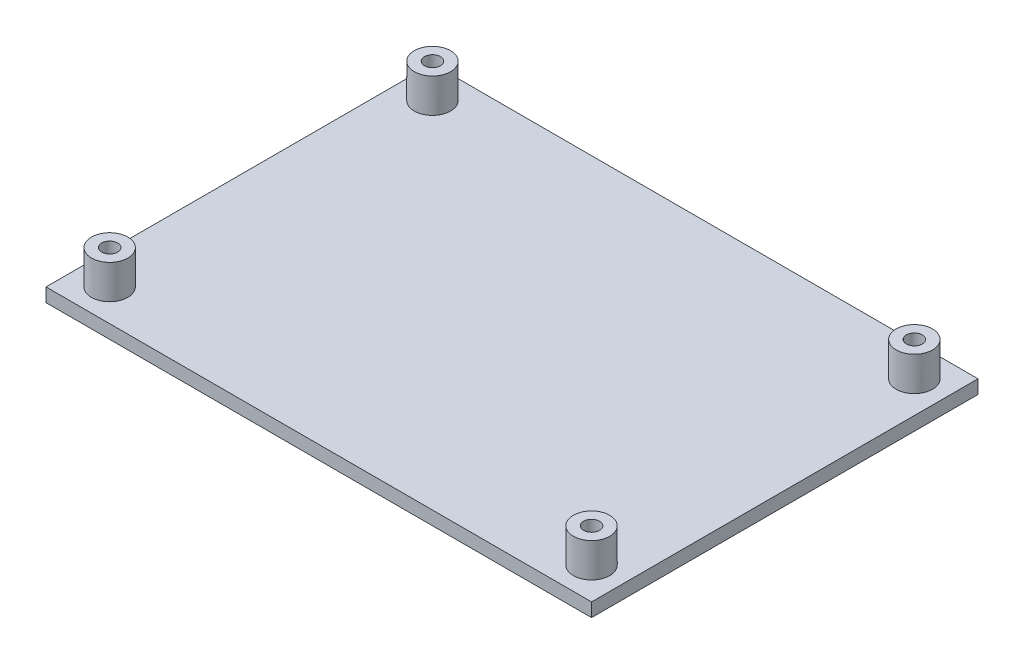
ISO-10303-21;
HEADER;
FILE_DESCRIPTION(('STEP AP214'),'2;1');
FILE_NAME('part.step','',(''),(''),'','','');
FILE_SCHEMA(('AUTOMOTIVE_DESIGN { 1 0 10303 214 1 1 1 1 }'));
ENDSEC;
DATA;
#1=APPLICATION_CONTEXT('core data for automotive mechanical design processes');
#2=APPLICATION_PROTOCOL_DEFINITION('international standard','automotive_design',2000,#1);
#3=PRODUCT_CONTEXT('',#1,'mechanical');
#4=PRODUCT('Part','Part','',(#3));
#5=PRODUCT_RELATED_PRODUCT_CATEGORY('part','',(#4));
#6=PRODUCT_DEFINITION_FORMATION('','',#4);
#7=PRODUCT_DEFINITION_CONTEXT('part definition',#1,'design');
#8=PRODUCT_DEFINITION('design','',#6,#7);
#9=PRODUCT_DEFINITION_SHAPE('','',#8);
#10=(LENGTH_UNIT() NAMED_UNIT(*) SI_UNIT(.MILLI.,.METRE.));
#11=(NAMED_UNIT(*) PLANE_ANGLE_UNIT() SI_UNIT($,.RADIAN.));
#12=(NAMED_UNIT(*) SI_UNIT($,.STERADIAN.) SOLID_ANGLE_UNIT());
#13=UNCERTAINTY_MEASURE_WITH_UNIT(LENGTH_MEASURE(1.E-05),#10,'distance_accuracy_value','');
#14=(GEOMETRIC_REPRESENTATION_CONTEXT(3) GLOBAL_UNCERTAINTY_ASSIGNED_CONTEXT((#13)) GLOBAL_UNIT_ASSIGNED_CONTEXT((#10,
#11,#12)) REPRESENTATION_CONTEXT('',''));
#15=CARTESIAN_POINT('',(0.,0.,0.));
#16=DIRECTION('',(0.,0.,1.));
#17=DIRECTION('',(1.,0.,0.));
#18=AXIS2_PLACEMENT_3D('',#15,#16,#17);
#19=CARTESIAN_POINT('',(0.,3.,0.));
#20=DIRECTION('',(1.,0.,0.));
#21=DIRECTION('',(0.,0.,-1.));
#22=AXIS2_PLACEMENT_3D('',#19,#20,#21);
#23=PLANE('',#22);
#24=DIRECTION('',(0.,0.,1.));
#25=VECTOR('',#24,1.);
#26=CARTESIAN_POINT('',(0.,0.,0.));
#27=LINE('',#26,#25);
#28=CARTESIAN_POINT('',(0.,0.,-85.));
#29=VERTEX_POINT('',#28);
#30=CARTESIAN_POINT('',(0.,0.,0.));
#31=VERTEX_POINT('',#30);
#32=EDGE_CURVE('E102',#29,#31,#27,.T.);
#33=ORIENTED_EDGE('',*,*,#32,.T.);
#34=DIRECTION('',(0.,-1.,0.));
#35=VECTOR('',#34,1.);
#36=CARTESIAN_POINT('',(0.,3.,0.));
#37=LINE('',#36,#35);
#38=CARTESIAN_POINT('',(0.,3.,0.));
#39=VERTEX_POINT('',#38);
#40=EDGE_CURVE('E93',#39,#31,#37,.T.);
#41=ORIENTED_EDGE('',*,*,#40,.F.);
#42=DIRECTION('',(0.,0.,1.));
#43=VECTOR('',#42,1.);
#44=CARTESIAN_POINT('',(0.,3.,0.));
#45=LINE('',#44,#43);
#46=CARTESIAN_POINT('',(0.,3.,-85.));
#47=VERTEX_POINT('',#46);
#48=EDGE_CURVE('E87',#47,#39,#45,.T.);
#49=ORIENTED_EDGE('',*,*,#48,.F.);
#50=DIRECTION('',(0.,-1.,0.));
#51=VECTOR('',#50,1.);
#52=CARTESIAN_POINT('',(0.,3.,-85.));
#53=LINE('',#52,#51);
#54=EDGE_CURVE('E98',#47,#29,#53,.T.);
#55=ORIENTED_EDGE('',*,*,#54,.T.);
#56=EDGE_LOOP('',(#33,#41,#49,#55));
#57=FACE_BOUND('',#56,.T.);
#58=ADVANCED_FACE('F35',(#57),#23,.F.);
#59=CARTESIAN_POINT('',(0.,3.,0.));
#60=DIRECTION('',(0.,0.,-1.));
#61=DIRECTION('',(-1.,0.,0.));
#62=AXIS2_PLACEMENT_3D('',#59,#60,#61);
#63=PLANE('',#62);
#64=DIRECTION('',(1.,0.,0.));
#65=VECTOR('',#64,1.);
#66=CARTESIAN_POINT('',(0.,0.,0.));
#67=LINE('',#66,#65);
#68=CARTESIAN_POINT('',(120.,0.,0.));
#69=VERTEX_POINT('',#68);
#70=EDGE_CURVE('E92',#31,#69,#67,.T.);
#71=ORIENTED_EDGE('',*,*,#70,.T.);
#72=DIRECTION('',(0.,-1.,0.));
#73=VECTOR('',#72,1.);
#74=CARTESIAN_POINT('',(120.,3.,0.));
#75=LINE('',#74,#73);
#76=CARTESIAN_POINT('',(120.,3.,0.));
#77=VERTEX_POINT('',#76);
#78=EDGE_CURVE('E90',#77,#69,#75,.T.);
#79=ORIENTED_EDGE('',*,*,#78,.F.);
#80=DIRECTION('',(1.,0.,0.));
#81=VECTOR('',#80,1.);
#82=CARTESIAN_POINT('',(0.,3.,0.));
#83=LINE('',#82,#81);
#84=EDGE_CURVE('E82',#39,#77,#83,.T.);
#85=ORIENTED_EDGE('',*,*,#84,.F.);
#86=ORIENTED_EDGE('',*,*,#40,.T.);
#87=EDGE_LOOP('',(#71,#79,#85,#86));
#88=FACE_BOUND('',#87,.T.);
#89=ADVANCED_FACE('F91',(#88),#63,.F.);
#90=CARTESIAN_POINT('',(120.,3.,0.));
#91=DIRECTION('',(-1.,0.,0.));
#92=DIRECTION('',(0.,0.,1.));
#93=AXIS2_PLACEMENT_3D('',#90,#91,#92);
#94=PLANE('',#93);
#95=DIRECTION('',(0.,0.,-1.));
#96=VECTOR('',#95,1.);
#97=CARTESIAN_POINT('',(120.,0.,0.));
#98=LINE('',#97,#96);
#99=CARTESIAN_POINT('',(120.,0.,-85.));
#100=VERTEX_POINT('',#99);
#101=EDGE_CURVE('E68',#69,#100,#98,.T.);
#102=ORIENTED_EDGE('',*,*,#101,.T.);
#103=DIRECTION('',(0.,-1.,0.));
#104=VECTOR('',#103,1.);
#105=CARTESIAN_POINT('',(120.,3.,-85.));
#106=LINE('',#105,#104);
#107=CARTESIAN_POINT('',(120.,3.,-85.));
#108=VERTEX_POINT('',#107);
#109=EDGE_CURVE('E94',#108,#100,#106,.T.);
#110=ORIENTED_EDGE('',*,*,#109,.F.);
#111=DIRECTION('',(0.,0.,-1.));
#112=VECTOR('',#111,1.);
#113=CARTESIAN_POINT('',(120.,3.,0.));
#114=LINE('',#113,#112);
#115=EDGE_CURVE('E85',#77,#108,#114,.T.);
#116=ORIENTED_EDGE('',*,*,#115,.F.);
#117=ORIENTED_EDGE('',*,*,#78,.T.);
#118=EDGE_LOOP('',(#102,#110,#116,#117));
#119=FACE_BOUND('',#118,.T.);
#120=ADVANCED_FACE('F96',(#119),#94,.F.);
#121=CARTESIAN_POINT('',(0.,3.,-85.));
#122=DIRECTION('',(0.,0.,1.));
#123=DIRECTION('',(1.,0.,0.));
#124=AXIS2_PLACEMENT_3D('',#121,#122,#123);
#125=PLANE('',#124);
#126=DIRECTION('',(-1.,0.,0.));
#127=VECTOR('',#126,1.);
#128=CARTESIAN_POINT('',(0.,0.,-85.));
#129=LINE('',#128,#127);
#130=EDGE_CURVE('E74',#100,#29,#129,.T.);
#131=ORIENTED_EDGE('',*,*,#130,.T.);
#132=ORIENTED_EDGE('',*,*,#54,.F.);
#133=DIRECTION('',(-1.,0.,0.));
#134=VECTOR('',#133,1.);
#135=CARTESIAN_POINT('',(0.,3.,-85.));
#136=LINE('',#135,#134);
#137=EDGE_CURVE('E51',#108,#47,#136,.T.);
#138=ORIENTED_EDGE('',*,*,#137,.F.);
#139=ORIENTED_EDGE('',*,*,#109,.T.);
#140=EDGE_LOOP('',(#131,#132,#138,#139));
#141=FACE_BOUND('',#140,.T.);
#142=ADVANCED_FACE('F125',(#141),#125,.F.);
#143=CARTESIAN_POINT('',(0.,3.,0.));
#144=DIRECTION('',(0.,-1.,0.));
#145=DIRECTION('',(0.,0.,-1.));
#146=AXIS2_PLACEMENT_3D('',#143,#144,#145);
#147=PLANE('',#146);
#148=CARTESIAN_POINT('',(113.,3.,-78.));
#149=DIRECTION('',(0.,-1.,0.));
#150=DIRECTION('',(0.,0.,-1.));
#151=AXIS2_PLACEMENT_3D('',#148,#149,#150);
#152=CIRCLE('',#151,4.00000000000001);
#153=CARTESIAN_POINT('',(113.,3.,-82.));
#154=VERTEX_POINT('',#153);
#155=EDGE_CURVE('E11',#154,#154,#152,.F.);
#156=ORIENTED_EDGE('',*,*,#155,.F.);
#157=EDGE_LOOP('',(#156));
#158=FACE_BOUND('',#157,.T.);
#159=CARTESIAN_POINT('',(113.,3.,-7.));
#160=DIRECTION('',(0.,-1.,0.));
#161=DIRECTION('',(0.,0.,-1.));
#162=AXIS2_PLACEMENT_3D('',#159,#160,#161);
#163=CIRCLE('',#162,4.00000000000001);
#164=CARTESIAN_POINT('',(113.,3.,-11.));
#165=VERTEX_POINT('',#164);
#166=EDGE_CURVE('E43',#165,#165,#163,.F.);
#167=ORIENTED_EDGE('',*,*,#166,.F.);
#168=EDGE_LOOP('',(#167));
#169=FACE_BOUND('',#168,.T.);
#170=CARTESIAN_POINT('',(7.00000000000001,3.,-7.));
#171=DIRECTION('',(0.,-1.,0.));
#172=DIRECTION('',(0.,0.,-1.));
#173=AXIS2_PLACEMENT_3D('',#170,#171,#172);
#174=CIRCLE('',#173,4.);
#175=CARTESIAN_POINT('',(7.00000000000001,3.,-11.));
#176=VERTEX_POINT('',#175);
#177=EDGE_CURVE('E115',#176,#176,#174,.F.);
#178=ORIENTED_EDGE('',*,*,#177,.F.);
#179=EDGE_LOOP('',(#178));
#180=FACE_BOUND('',#179,.T.);
#181=CARTESIAN_POINT('',(7.00000000000001,3.,-78.));
#182=DIRECTION('',(0.,-1.,0.));
#183=DIRECTION('',(0.,0.,-1.));
#184=AXIS2_PLACEMENT_3D('',#181,#182,#183);
#185=CIRCLE('',#184,4.);
#186=CARTESIAN_POINT('',(7.00000000000001,3.,-82.));
#187=VERTEX_POINT('',#186);
#188=EDGE_CURVE('E112',#187,#187,#185,.F.);
#189=ORIENTED_EDGE('',*,*,#188,.F.);
#190=EDGE_LOOP('',(#189));
#191=FACE_BOUND('',#190,.T.);
#192=ORIENTED_EDGE('',*,*,#48,.T.);
#193=ORIENTED_EDGE('',*,*,#84,.T.);
#194=ORIENTED_EDGE('',*,*,#115,.T.);
#195=ORIENTED_EDGE('',*,*,#137,.T.);
#196=EDGE_LOOP('',(#192,#193,#194,#195));
#197=FACE_BOUND('',#196,.T.);
#198=ADVANCED_FACE('F83',(#158,#169,#180,#191,#197),#147,.F.);
#199=CARTESIAN_POINT('',(0.,0.,0.));
#200=DIRECTION('',(0.,-1.,0.));
#201=DIRECTION('',(0.,0.,-1.));
#202=AXIS2_PLACEMENT_3D('',#199,#200,#201);
#203=PLANE('',#202);
#204=ORIENTED_EDGE('',*,*,#32,.F.);
#205=ORIENTED_EDGE('',*,*,#130,.F.);
#206=ORIENTED_EDGE('',*,*,#101,.F.);
#207=ORIENTED_EDGE('',*,*,#70,.F.);
#208=EDGE_LOOP('',(#204,#205,#206,#207));
#209=FACE_BOUND('',#208,.T.);
#210=ADVANCED_FACE('F124',(#209),#203,.T.);
#211=CARTESIAN_POINT('',(7.00000000000001,10.5,-78.));
#212=DIRECTION('',(0.,1.,0.));
#213=DIRECTION('',(0.,0.,1.));
#214=AXIS2_PLACEMENT_3D('',#211,#212,#213);
#215=PLANE('',#214);
#216=CARTESIAN_POINT('',(7.00000000000001,10.5,-78.));
#217=DIRECTION('',(0.,1.,0.));
#218=DIRECTION('',(0.,0.,1.));
#219=AXIS2_PLACEMENT_3D('',#216,#217,#218);
#220=CIRCLE('',#219,4.);
#221=CARTESIAN_POINT('',(7.00000000000001,10.5,-74.));
#222=VERTEX_POINT('',#221);
#223=EDGE_CURVE('E105',#222,#222,#220,.T.);
#224=ORIENTED_EDGE('',*,*,#223,.T.);
#225=EDGE_LOOP('',(#224));
#226=FACE_BOUND('',#225,.T.);
#227=CARTESIAN_POINT('',(7.00000000000001,10.5,-78.));
#228=DIRECTION('',(0.,1.,0.));
#229=DIRECTION('',(0.,0.,1.));
#230=AXIS2_PLACEMENT_3D('',#227,#228,#229);
#231=CIRCLE('',#230,1.75);
#232=CARTESIAN_POINT('',(7.00000000000001,10.5,-76.25));
#233=VERTEX_POINT('',#232);
#234=EDGE_CURVE('E352',#233,#233,#231,.T.);
#235=ORIENTED_EDGE('',*,*,#234,.F.);
#236=EDGE_LOOP('',(#235));
#237=FACE_BOUND('',#236,.T.);
#238=ADVANCED_FACE('F137',(#226,#237),#215,.T.);
#239=CARTESIAN_POINT('',(7.00000000000001,10.5,-78.));
#240=DIRECTION('',(0.,-1.,0.));
#241=DIRECTION('',(0.,0.,-1.));
#242=AXIS2_PLACEMENT_3D('',#239,#240,#241);
#243=CYLINDRICAL_SURFACE('',#242,4.);
#244=ORIENTED_EDGE('',*,*,#223,.F.);
#245=EDGE_LOOP('',(#244));
#246=FACE_BOUND('',#245,.T.);
#247=ORIENTED_EDGE('',*,*,#188,.T.);
#248=EDGE_LOOP('',(#247));
#249=FACE_BOUND('',#248,.T.);
#250=ADVANCED_FACE('F134',(#246,#249),#243,.T.);
#251=CARTESIAN_POINT('',(7.00000000000001,10.5,-78.));
#252=DIRECTION('',(0.,-1.,0.));
#253=DIRECTION('',(0.,0.,-1.));
#254=AXIS2_PLACEMENT_3D('',#251,#252,#253);
#255=CYLINDRICAL_SURFACE('',#254,1.75);
#256=ORIENTED_EDGE('',*,*,#234,.T.);
#257=EDGE_LOOP('',(#256));
#258=FACE_BOUND('',#257,.T.);
#259=CARTESIAN_POINT('',(7.00000000000001,3.,-78.));
#260=DIRECTION('',(0.,1.,0.));
#261=DIRECTION('',(0.,0.,1.));
#262=AXIS2_PLACEMENT_3D('',#259,#260,#261);
#263=CIRCLE('',#262,1.75);
#264=CARTESIAN_POINT('',(7.00000000000001,3.,-76.25));
#265=VERTEX_POINT('',#264);
#266=EDGE_CURVE('E351',#265,#265,#263,.T.);
#267=ORIENTED_EDGE('',*,*,#266,.F.);
#268=EDGE_LOOP('',(#267));
#269=FACE_BOUND('',#268,.T.);
#270=ADVANCED_FACE('F136',(#258,#269),#255,.F.);
#271=ORIENTED_EDGE('',*,*,#266,.T.);
#272=EDGE_LOOP('',(#271));
#273=FACE_BOUND('',#272,.T.);
#274=ADVANCED_FACE('F129',(#273),#147,.F.);
#275=CARTESIAN_POINT('',(7.00000000000001,10.5,-7.));
#276=DIRECTION('',(0.,1.,0.));
#277=DIRECTION('',(0.,0.,1.));
#278=AXIS2_PLACEMENT_3D('',#275,#276,#277);
#279=PLANE('',#278);
#280=CARTESIAN_POINT('',(7.00000000000001,10.5,-7.));
#281=DIRECTION('',(0.,1.,0.));
#282=DIRECTION('',(0.,0.,1.));
#283=AXIS2_PLACEMENT_3D('',#280,#281,#282);
#284=CIRCLE('',#283,4.);
#285=CARTESIAN_POINT('',(7.00000000000001,10.5,-3.));
#286=VERTEX_POINT('',#285);
#287=EDGE_CURVE('E346',#286,#286,#284,.T.);
#288=ORIENTED_EDGE('',*,*,#287,.T.);
#289=EDGE_LOOP('',(#288));
#290=FACE_BOUND('',#289,.T.);
#291=CARTESIAN_POINT('',(7.00000000000001,10.5,-7.));
#292=DIRECTION('',(0.,1.,0.));
#293=DIRECTION('',(0.,0.,1.));
#294=AXIS2_PLACEMENT_3D('',#291,#292,#293);
#295=CIRCLE('',#294,1.75);
#296=CARTESIAN_POINT('',(7.00000000000001,10.5,-5.25));
#297=VERTEX_POINT('',#296);
#298=EDGE_CURVE('E343',#297,#297,#295,.T.);
#299=ORIENTED_EDGE('',*,*,#298,.F.);
#300=EDGE_LOOP('',(#299));
#301=FACE_BOUND('',#300,.T.);
#302=ADVANCED_FACE('F205',(#290,#301),#279,.T.);
#303=CARTESIAN_POINT('',(7.00000000000001,10.5,-7.));
#304=DIRECTION('',(0.,-1.,0.));
#305=DIRECTION('',(0.,0.,-1.));
#306=AXIS2_PLACEMENT_3D('',#303,#304,#305);
#307=CYLINDRICAL_SURFACE('',#306,4.);
#308=ORIENTED_EDGE('',*,*,#287,.F.);
#309=EDGE_LOOP('',(#308));
#310=FACE_BOUND('',#309,.T.);
#311=ORIENTED_EDGE('',*,*,#177,.T.);
#312=EDGE_LOOP('',(#311));
#313=FACE_BOUND('',#312,.T.);
#314=ADVANCED_FACE('F215',(#310,#313),#307,.T.);
#315=CARTESIAN_POINT('',(7.00000000000001,10.5,-7.));
#316=DIRECTION('',(0.,-1.,0.));
#317=DIRECTION('',(0.,0.,-1.));
#318=AXIS2_PLACEMENT_3D('',#315,#316,#317);
#319=CYLINDRICAL_SURFACE('',#318,1.75);
#320=ORIENTED_EDGE('',*,*,#298,.T.);
#321=EDGE_LOOP('',(#320));
#322=FACE_BOUND('',#321,.T.);
#323=CARTESIAN_POINT('',(7.00000000000001,3.,-7.));
#324=DIRECTION('',(0.,1.,0.));
#325=DIRECTION('',(0.,0.,1.));
#326=AXIS2_PLACEMENT_3D('',#323,#324,#325);
#327=CIRCLE('',#326,1.75);
#328=CARTESIAN_POINT('',(7.00000000000001,3.,-5.25));
#329=VERTEX_POINT('',#328);
#330=EDGE_CURVE('E342',#329,#329,#327,.T.);
#331=ORIENTED_EDGE('',*,*,#330,.F.);
#332=EDGE_LOOP('',(#331));
#333=FACE_BOUND('',#332,.T.);
#334=ADVANCED_FACE('F225',(#322,#333),#319,.F.);
#335=ORIENTED_EDGE('',*,*,#330,.T.);
#336=EDGE_LOOP('',(#335));
#337=FACE_BOUND('',#336,.T.);
#338=ADVANCED_FACE('F207',(#337),#147,.F.);
#339=CARTESIAN_POINT('',(113.,10.5,-7.));
#340=DIRECTION('',(0.,1.,0.));
#341=DIRECTION('',(0.,0.,1.));
#342=AXIS2_PLACEMENT_3D('',#339,#340,#341);
#343=PLANE('',#342);
#344=CARTESIAN_POINT('',(113.,10.5,-7.));
#345=DIRECTION('',(0.,1.,0.));
#346=DIRECTION('',(0.,0.,1.));
#347=AXIS2_PLACEMENT_3D('',#344,#345,#346);
#348=CIRCLE('',#347,4.00000000000001);
#349=CARTESIAN_POINT('',(113.,10.5,-2.99999999999999));
#350=VERTEX_POINT('',#349);
#351=EDGE_CURVE('E337',#350,#350,#348,.T.);
#352=ORIENTED_EDGE('',*,*,#351,.T.);
#353=EDGE_LOOP('',(#352));
#354=FACE_BOUND('',#353,.T.);
#355=CARTESIAN_POINT('',(113.,10.5,-7.));
#356=DIRECTION('',(0.,1.,0.));
#357=DIRECTION('',(0.,0.,1.));
#358=AXIS2_PLACEMENT_3D('',#355,#356,#357);
#359=CIRCLE('',#358,1.75);
#360=CARTESIAN_POINT('',(113.,10.5,-5.25));
#361=VERTEX_POINT('',#360);
#362=EDGE_CURVE('E334',#361,#361,#359,.T.);
#363=ORIENTED_EDGE('',*,*,#362,.F.);
#364=EDGE_LOOP('',(#363));
#365=FACE_BOUND('',#364,.T.);
#366=ADVANCED_FACE('F244',(#354,#365),#343,.T.);
#367=CARTESIAN_POINT('',(113.,10.5,-7.));
#368=DIRECTION('',(0.,-1.,0.));
#369=DIRECTION('',(0.,0.,-1.));
#370=AXIS2_PLACEMENT_3D('',#367,#368,#369);
#371=CYLINDRICAL_SURFACE('',#370,4.00000000000001);
#372=ORIENTED_EDGE('',*,*,#351,.F.);
#373=EDGE_LOOP('',(#372));
#374=FACE_BOUND('',#373,.T.);
#375=ORIENTED_EDGE('',*,*,#166,.T.);
#376=EDGE_LOOP('',(#375));
#377=FACE_BOUND('',#376,.T.);
#378=ADVANCED_FACE('F120',(#374,#377),#371,.T.);
#379=CARTESIAN_POINT('',(113.,10.5,-7.));
#380=DIRECTION('',(0.,-1.,0.));
#381=DIRECTION('',(0.,0.,-1.));
#382=AXIS2_PLACEMENT_3D('',#379,#380,#381);
#383=CYLINDRICAL_SURFACE('',#382,1.75);
#384=ORIENTED_EDGE('',*,*,#362,.T.);
#385=EDGE_LOOP('',(#384));
#386=FACE_BOUND('',#385,.T.);
#387=CARTESIAN_POINT('',(113.,3.,-7.));
#388=DIRECTION('',(0.,1.,0.));
#389=DIRECTION('',(0.,0.,1.));
#390=AXIS2_PLACEMENT_3D('',#387,#388,#389);
#391=CIRCLE('',#390,1.75);
#392=CARTESIAN_POINT('',(113.,3.,-5.25));
#393=VERTEX_POINT('',#392);
#394=EDGE_CURVE('E333',#393,#393,#391,.T.);
#395=ORIENTED_EDGE('',*,*,#394,.F.);
#396=EDGE_LOOP('',(#395));
#397=FACE_BOUND('',#396,.T.);
#398=ADVANCED_FACE('F263',(#386,#397),#383,.F.);
#399=ORIENTED_EDGE('',*,*,#394,.T.);
#400=EDGE_LOOP('',(#399));
#401=FACE_BOUND('',#400,.T.);
#402=ADVANCED_FACE('F246',(#401),#147,.F.);
#403=CARTESIAN_POINT('',(113.,10.5,-78.));
#404=DIRECTION('',(0.,1.,0.));
#405=DIRECTION('',(0.,0.,1.));
#406=AXIS2_PLACEMENT_3D('',#403,#404,#405);
#407=PLANE('',#406);
#408=CARTESIAN_POINT('',(113.,10.5,-78.));
#409=DIRECTION('',(0.,1.,0.));
#410=DIRECTION('',(0.,0.,1.));
#411=AXIS2_PLACEMENT_3D('',#408,#409,#410);
#412=CIRCLE('',#411,4.00000000000001);
#413=CARTESIAN_POINT('',(113.,10.5,-74.));
#414=VERTEX_POINT('',#413);
#415=EDGE_CURVE('E328',#414,#414,#412,.T.);
#416=ORIENTED_EDGE('',*,*,#415,.T.);
#417=EDGE_LOOP('',(#416));
#418=FACE_BOUND('',#417,.T.);
#419=CARTESIAN_POINT('',(113.,10.5,-78.));
#420=DIRECTION('',(0.,1.,0.));
#421=DIRECTION('',(0.,0.,1.));
#422=AXIS2_PLACEMENT_3D('',#419,#420,#421);
#423=CIRCLE('',#422,1.75);
#424=CARTESIAN_POINT('',(113.,10.5,-76.25));
#425=VERTEX_POINT('',#424);
#426=EDGE_CURVE('E325',#425,#425,#423,.T.);
#427=ORIENTED_EDGE('',*,*,#426,.F.);
#428=EDGE_LOOP('',(#427));
#429=FACE_BOUND('',#428,.T.);
#430=ADVANCED_FACE('F282',(#418,#429),#407,.T.);
#431=CARTESIAN_POINT('',(113.,10.5,-78.));
#432=DIRECTION('',(0.,-1.,0.));
#433=DIRECTION('',(0.,0.,-1.));
#434=AXIS2_PLACEMENT_3D('',#431,#432,#433);
#435=CYLINDRICAL_SURFACE('',#434,4.00000000000001);
#436=ORIENTED_EDGE('',*,*,#415,.F.);
#437=EDGE_LOOP('',(#436));
#438=FACE_BOUND('',#437,.T.);
#439=ORIENTED_EDGE('',*,*,#155,.T.);
#440=EDGE_LOOP('',(#439));
#441=FACE_BOUND('',#440,.T.);
#442=ADVANCED_FACE('F290',(#438,#441),#435,.T.);
#443=CARTESIAN_POINT('',(113.,10.5,-78.));
#444=DIRECTION('',(0.,-1.,0.));
#445=DIRECTION('',(0.,0.,-1.));
#446=AXIS2_PLACEMENT_3D('',#443,#444,#445);
#447=CYLINDRICAL_SURFACE('',#446,1.75);
#448=ORIENTED_EDGE('',*,*,#426,.T.);
#449=EDGE_LOOP('',(#448));
#450=FACE_BOUND('',#449,.T.);
#451=CARTESIAN_POINT('',(113.,3.,-78.));
#452=DIRECTION('',(0.,1.,0.));
#453=DIRECTION('',(0.,0.,1.));
#454=AXIS2_PLACEMENT_3D('',#451,#452,#453);
#455=CIRCLE('',#454,1.75);
#456=CARTESIAN_POINT('',(113.,3.,-76.25));
#457=VERTEX_POINT('',#456);
#458=EDGE_CURVE('E323',#457,#457,#455,.T.);
#459=ORIENTED_EDGE('',*,*,#458,.F.);
#460=EDGE_LOOP('',(#459));
#461=FACE_BOUND('',#460,.T.);
#462=ADVANCED_FACE('F300',(#450,#461),#447,.F.);
#463=ORIENTED_EDGE('',*,*,#458,.T.);
#464=EDGE_LOOP('',(#463));
#465=FACE_BOUND('',#464,.T.);
#466=ADVANCED_FACE('F128',(#465),#147,.F.);
#467=CLOSED_SHELL('',(#58,#89,#120,#142,#198,#210,#238,#250,#270,#274,#302,#314,#334,#338,#366,
#378,#398,#402,#430,#442,#462,#466));
#468=MANIFOLD_SOLID_BREP('B2',#467);
#469=ADVANCED_BREP_SHAPE_REPRESENTATION('',(#18,#468),#14);
#470=SHAPE_DEFINITION_REPRESENTATION(#9,#469);
ENDSEC;
END-ISO-10303-21;
